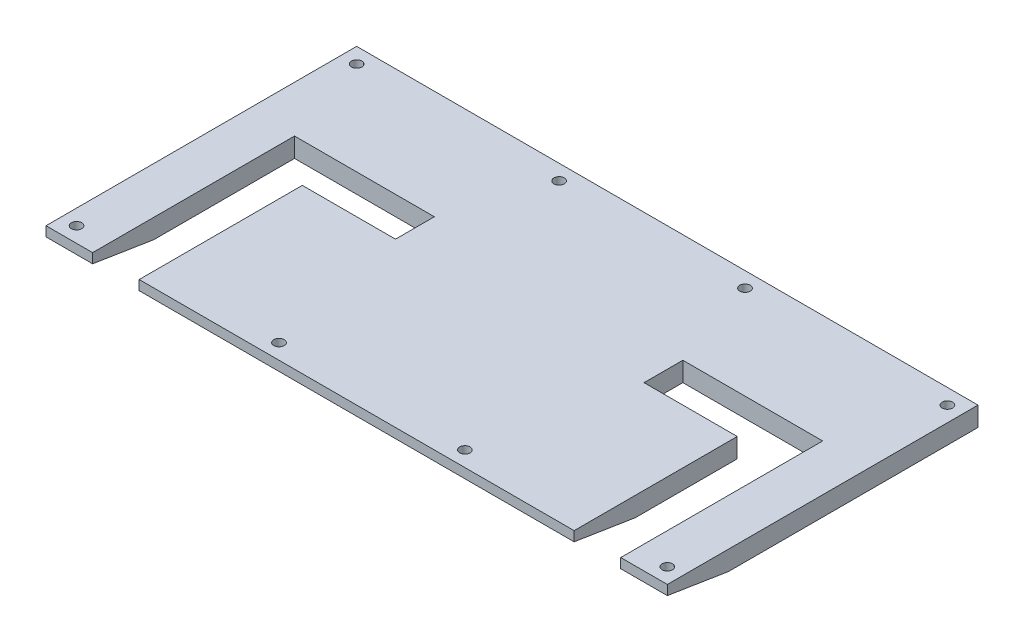
ISO-10303-21;
HEADER;
FILE_DESCRIPTION(('STEP AP214'),'2;1');
FILE_NAME('part.step','',(''),(''),'','','');
FILE_SCHEMA(('AUTOMOTIVE_DESIGN { 1 0 10303 214 1 1 1 1 }'));
ENDSEC;
DATA;
#1=APPLICATION_CONTEXT('core data for automotive mechanical design processes');
#2=APPLICATION_PROTOCOL_DEFINITION('international standard','automotive_design',2000,#1);
#3=PRODUCT_CONTEXT('',#1,'mechanical');
#4=PRODUCT('Part','Part','',(#3));
#5=PRODUCT_RELATED_PRODUCT_CATEGORY('part','',(#4));
#6=PRODUCT_DEFINITION_FORMATION('','',#4);
#7=PRODUCT_DEFINITION_CONTEXT('part definition',#1,'design');
#8=PRODUCT_DEFINITION('design','',#6,#7);
#9=PRODUCT_DEFINITION_SHAPE('','',#8);
#10=(LENGTH_UNIT() NAMED_UNIT(*) SI_UNIT(.MILLI.,.METRE.));
#11=(NAMED_UNIT(*) PLANE_ANGLE_UNIT() SI_UNIT($,.RADIAN.));
#12=(NAMED_UNIT(*) SI_UNIT($,.STERADIAN.) SOLID_ANGLE_UNIT());
#13=UNCERTAINTY_MEASURE_WITH_UNIT(LENGTH_MEASURE(1.E-05),#10,'distance_accuracy_value','');
#14=(GEOMETRIC_REPRESENTATION_CONTEXT(3) GLOBAL_UNCERTAINTY_ASSIGNED_CONTEXT((#13)) GLOBAL_UNIT_ASSIGNED_CONTEXT((#10,
#11,#12)) REPRESENTATION_CONTEXT('',''));
#15=CARTESIAN_POINT('',(0.,0.,0.));
#16=DIRECTION('',(0.,0.,1.));
#17=DIRECTION('',(1.,0.,0.));
#18=AXIS2_PLACEMENT_3D('',#15,#16,#17);
#19=CARTESIAN_POINT('',(10.,6.35,0.));
#20=DIRECTION('',(0.,0.,-1.));
#21=DIRECTION('',(-1.,0.,0.));
#22=AXIS2_PLACEMENT_3D('',#19,#20,#21);
#23=PLANE('',#22);
#24=DIRECTION('',(-1.,0.,0.));
#25=VECTOR('',#24,1.);
#26=CARTESIAN_POINT('',(76.2,3.175,0.));
#27=LINE('',#26,#25);
#28=CARTESIAN_POINT('',(45.72,3.175,0.));
#29=VERTEX_POINT('',#28);
#30=CARTESIAN_POINT('',(-96.52,3.175,0.));
#31=VERTEX_POINT('',#30);
#32=EDGE_CURVE('E227',#29,#31,#27,.T.);
#33=ORIENTED_EDGE('',*,*,#32,.F.);
#34=DIRECTION('',(0.,-1.,0.));
#35=VECTOR('',#34,1.);
#36=CARTESIAN_POINT('',(45.72,6.35,0.));
#37=LINE('',#36,#35);
#38=CARTESIAN_POINT('',(45.72,6.35,0.));
#39=VERTEX_POINT('',#38);
#40=EDGE_CURVE('E11',#39,#29,#37,.T.);
#41=ORIENTED_EDGE('',*,*,#40,.F.);
#42=DIRECTION('',(1.,0.,0.));
#43=VECTOR('',#42,1.);
#44=CARTESIAN_POINT('',(0.,6.35,0.));
#45=LINE('',#44,#43);
#46=CARTESIAN_POINT('',(-96.52,6.35,0.));
#47=VERTEX_POINT('',#46);
#48=EDGE_CURVE('E97',#47,#39,#45,.T.);
#49=ORIENTED_EDGE('',*,*,#48,.F.);
#50=DIRECTION('',(0.,-1.,0.));
#51=VECTOR('',#50,1.);
#52=CARTESIAN_POINT('',(-96.52,6.35,0.));
#53=LINE('',#52,#51);
#54=EDGE_CURVE('E234',#47,#31,#53,.T.);
#55=ORIENTED_EDGE('',*,*,#54,.T.);
#56=EDGE_LOOP('',(#33,#41,#49,#55));
#57=FACE_BOUND('',#56,.T.);
#58=ADVANCED_FACE('F41',(#57),#23,.F.);
#59=CARTESIAN_POINT('',(45.72,6.35,0.));
#60=DIRECTION('',(-1.,0.,0.));
#61=DIRECTION('',(0.,0.,1.));
#62=AXIS2_PLACEMENT_3D('',#59,#60,#61);
#63=PLANE('',#62);
#64=DIRECTION('',(0.,0.156786658464522,0.987632494264709));
#65=VECTOR('',#64,1.);
#66=CARTESIAN_POINT('',(45.72,3.25304802866509,0.491641125449416));
#67=LINE('',#66,#65);
#68=CARTESIAN_POINT('',(45.72,0.,-20.));
#69=VERTEX_POINT('',#68);
#70=EDGE_CURVE('E211',#69,#29,#67,.T.);
#71=ORIENTED_EDGE('',*,*,#70,.F.);
#72=DIRECTION('',(0.,0.,-1.));
#73=VECTOR('',#72,1.);
#74=CARTESIAN_POINT('',(45.72,0.,0.));
#75=LINE('',#74,#73);
#76=CARTESIAN_POINT('',(45.72,0.,-53.34));
#77=VERTEX_POINT('',#76);
#78=EDGE_CURVE('E145',#69,#77,#75,.T.);
#79=ORIENTED_EDGE('',*,*,#78,.T.);
#80=DIRECTION('',(0.,-1.,0.));
#81=VECTOR('',#80,1.);
#82=CARTESIAN_POINT('',(45.72,6.35,-53.34));
#83=LINE('',#82,#81);
#84=CARTESIAN_POINT('',(45.72,6.35,-53.34));
#85=VERTEX_POINT('',#84);
#86=EDGE_CURVE('E49',#85,#77,#83,.T.);
#87=ORIENTED_EDGE('',*,*,#86,.F.);
#88=DIRECTION('',(0.,0.,-1.));
#89=VECTOR('',#88,1.);
#90=CARTESIAN_POINT('',(45.72,6.35,0.));
#91=LINE('',#90,#89);
#92=EDGE_CURVE('E198',#39,#85,#91,.T.);
#93=ORIENTED_EDGE('',*,*,#92,.F.);
#94=ORIENTED_EDGE('',*,*,#40,.T.);
#95=EDGE_LOOP('',(#71,#79,#87,#93,#94));
#96=FACE_BOUND('',#95,.T.);
#97=ADVANCED_FACE('F384',(#96),#63,.F.);
#98=CARTESIAN_POINT('',(60.96,6.35,-66.04));
#99=DIRECTION('',(1.,0.,0.));
#100=DIRECTION('',(0.,0.,-1.));
#101=AXIS2_PLACEMENT_3D('',#98,#99,#100);
#102=PLANE('',#101);
#103=DIRECTION('',(0.,-0.156786658464522,-0.987632494264709));
#104=VECTOR('',#103,1.);
#105=CARTESIAN_POINT('',(60.96,-6.97308738068276,-63.9249598783166));
#106=LINE('',#105,#104);
#107=CARTESIAN_POINT('',(60.96,3.175,0.));
#108=VERTEX_POINT('',#107);
#109=CARTESIAN_POINT('',(60.96,0.,-20.));
#110=VERTEX_POINT('',#109);
#111=EDGE_CURVE('E56',#108,#110,#106,.T.);
#112=ORIENTED_EDGE('',*,*,#111,.F.);
#113=DIRECTION('',(0.,-1.,0.));
#114=VECTOR('',#113,1.);
#115=CARTESIAN_POINT('',(60.96,6.35,0.));
#116=LINE('',#115,#114);
#117=CARTESIAN_POINT('',(60.96,6.35,0.));
#118=VERTEX_POINT('',#117);
#119=EDGE_CURVE('E127',#118,#108,#116,.T.);
#120=ORIENTED_EDGE('',*,*,#119,.F.);
#121=DIRECTION('',(0.,0.,1.));
#122=VECTOR('',#121,1.);
#123=CARTESIAN_POINT('',(60.96,6.35,-66.04));
#124=LINE('',#123,#122);
#125=CARTESIAN_POINT('',(60.96,6.35,-66.04));
#126=VERTEX_POINT('',#125);
#127=EDGE_CURVE('E113',#126,#118,#124,.T.);
#128=ORIENTED_EDGE('',*,*,#127,.F.);
#129=DIRECTION('',(0.,-1.,0.));
#130=VECTOR('',#129,1.);
#131=CARTESIAN_POINT('',(60.96,6.35,-66.04));
#132=LINE('',#131,#130);
#133=CARTESIAN_POINT('',(60.96,0.,-66.04));
#134=VERTEX_POINT('',#133);
#135=EDGE_CURVE('E133',#126,#134,#132,.T.);
#136=ORIENTED_EDGE('',*,*,#135,.T.);
#137=DIRECTION('',(0.,0.,1.));
#138=VECTOR('',#137,1.);
#139=CARTESIAN_POINT('',(60.96,0.,-66.04));
#140=LINE('',#139,#138);
#141=EDGE_CURVE('E154',#134,#110,#140,.T.);
#142=ORIENTED_EDGE('',*,*,#141,.T.);
#143=EDGE_LOOP('',(#112,#120,#128,#136,#142));
#144=FACE_BOUND('',#143,.T.);
#145=ADVANCED_FACE('F128',(#144),#102,.F.);
#146=CARTESIAN_POINT('',(60.96,6.35,0.));
#147=DIRECTION('',(0.,0.,-1.));
#148=DIRECTION('',(-1.,0.,0.));
#149=AXIS2_PLACEMENT_3D('',#146,#147,#148);
#150=PLANE('',#149);
#151=CARTESIAN_POINT('',(76.2,3.175,0.));
#152=VERTEX_POINT('',#151);
#153=EDGE_CURVE('E229',#152,#108,#27,.T.);
#154=ORIENTED_EDGE('',*,*,#153,.F.);
#155=DIRECTION('',(0.,-1.,0.));
#156=VECTOR('',#155,1.);
#157=CARTESIAN_POINT('',(76.2,6.35,0.));
#158=LINE('',#157,#156);
#159=CARTESIAN_POINT('',(76.2,6.35,0.));
#160=VERTEX_POINT('',#159);
#161=EDGE_CURVE('E134',#160,#152,#158,.T.);
#162=ORIENTED_EDGE('',*,*,#161,.F.);
#163=DIRECTION('',(1.,0.,0.));
#164=VECTOR('',#163,1.);
#165=CARTESIAN_POINT('',(60.96,6.35,0.));
#166=LINE('',#165,#164);
#167=EDGE_CURVE('E118',#118,#160,#166,.T.);
#168=ORIENTED_EDGE('',*,*,#167,.F.);
#169=ORIENTED_EDGE('',*,*,#119,.T.);
#170=EDGE_LOOP('',(#154,#162,#168,#169));
#171=FACE_BOUND('',#170,.T.);
#172=ADVANCED_FACE('F136',(#171),#150,.F.);
#173=CARTESIAN_POINT('',(76.2,6.35,0.));
#174=DIRECTION('',(-1.,0.,0.));
#175=DIRECTION('',(0.,0.,1.));
#176=AXIS2_PLACEMENT_3D('',#173,#174,#175);
#177=PLANE('',#176);
#178=DIRECTION('',(0.,0.156786658464522,0.987632494264709));
#179=VECTOR('',#178,1.);
#180=CARTESIAN_POINT('',(76.2,3.0969519713349,-0.491641125449416));
#181=LINE('',#180,#179);
#182=CARTESIAN_POINT('',(76.2,0.,-20.));
#183=VERTEX_POINT('',#182);
#184=EDGE_CURVE('E231',#183,#152,#181,.T.);
#185=ORIENTED_EDGE('',*,*,#184,.F.);
#186=DIRECTION('',(0.,0.,-1.));
#187=VECTOR('',#186,1.);
#188=CARTESIAN_POINT('',(76.2,0.,0.));
#189=LINE('',#188,#187);
#190=CARTESIAN_POINT('',(76.2,0.,-101.6));
#191=VERTEX_POINT('',#190);
#192=EDGE_CURVE('E89',#183,#191,#189,.T.);
#193=ORIENTED_EDGE('',*,*,#192,.T.);
#194=DIRECTION('',(0.,-1.,0.));
#195=VECTOR('',#194,1.);
#196=CARTESIAN_POINT('',(76.2,6.35,-101.6));
#197=LINE('',#196,#195);
#198=CARTESIAN_POINT('',(76.2,6.35,-101.6));
#199=VERTEX_POINT('',#198);
#200=EDGE_CURVE('E144',#199,#191,#197,.T.);
#201=ORIENTED_EDGE('',*,*,#200,.F.);
#202=DIRECTION('',(0.,0.,-1.));
#203=VECTOR('',#202,1.);
#204=CARTESIAN_POINT('',(76.2,6.35,0.));
#205=LINE('',#204,#203);
#206=EDGE_CURVE('E65',#160,#199,#205,.T.);
#207=ORIENTED_EDGE('',*,*,#206,.F.);
#208=ORIENTED_EDGE('',*,*,#161,.T.);
#209=EDGE_LOOP('',(#185,#193,#201,#207,#208));
#210=FACE_BOUND('',#209,.T.);
#211=ADVANCED_FACE('F403',(#210),#177,.F.);
#212=CARTESIAN_POINT('',(0.,0.,0.));
#213=DIRECTION('',(0.,-1.,0.));
#214=DIRECTION('',(0.,0.,-1.));
#215=AXIS2_PLACEMENT_3D('',#212,#213,#214);
#216=PLANE('',#215);
#217=CARTESIAN_POINT('',(71.2,0.,-96.6));
#218=DIRECTION('',(0.,1.,0.));
#219=DIRECTION('',(0.,0.,-1.));
#220=AXIS2_PLACEMENT_3D('',#217,#218,#219);
#221=CIRCLE('',#220,1.7);
#222=CARTESIAN_POINT('',(71.2,0.,-98.3));
#223=VERTEX_POINT('',#222);
#224=EDGE_CURVE('E214',#223,#223,#221,.T.);
#225=ORIENTED_EDGE('',*,*,#224,.T.);
#226=EDGE_LOOP('',(#225));
#227=FACE_BOUND('',#226,.T.);
#228=CARTESIAN_POINT('',(5.,0.,-96.6));
#229=DIRECTION('',(0.,1.,0.));
#230=DIRECTION('',(0.,0.,1.));
#231=AXIS2_PLACEMENT_3D('',#228,#229,#230);
#232=CIRCLE('',#231,1.7);
#233=CARTESIAN_POINT('',(5.,0.,-94.9));
#234=VERTEX_POINT('',#233);
#235=EDGE_CURVE('E148',#234,#234,#232,.T.);
#236=ORIENTED_EDGE('',*,*,#235,.T.);
#237=EDGE_LOOP('',(#236));
#238=FACE_BOUND('',#237,.T.);
#239=ORIENTED_EDGE('',*,*,#192,.F.);
#240=DIRECTION('',(-1.,0.,0.));
#241=VECTOR('',#240,1.);
#242=CARTESIAN_POINT('',(76.2,0.,-20.));
#243=LINE('',#242,#241);
#244=EDGE_CURVE('E225',#183,#110,#243,.T.);
#245=ORIENTED_EDGE('',*,*,#244,.T.);
#246=ORIENTED_EDGE('',*,*,#141,.F.);
#247=DIRECTION('',(1.,0.,0.));
#248=VECTOR('',#247,1.);
#249=CARTESIAN_POINT('',(15.24,0.,-66.04));
#250=LINE('',#249,#248);
#251=CARTESIAN_POINT('',(15.24,0.,-66.04));
#252=VERTEX_POINT('',#251);
#253=EDGE_CURVE('E152',#252,#134,#250,.T.);
#254=ORIENTED_EDGE('',*,*,#253,.F.);
#255=DIRECTION('',(0.,0.,-1.));
#256=VECTOR('',#255,1.);
#257=CARTESIAN_POINT('',(15.24,0.,-53.34));
#258=LINE('',#257,#256);
#259=CARTESIAN_POINT('',(15.24,0.,-53.34));
#260=VERTEX_POINT('',#259);
#261=EDGE_CURVE('E150',#260,#252,#258,.T.);
#262=ORIENTED_EDGE('',*,*,#261,.F.);
#263=DIRECTION('',(-1.,0.,0.));
#264=VECTOR('',#263,1.);
#265=CARTESIAN_POINT('',(15.24,0.,-53.34));
#266=LINE('',#265,#264);
#267=EDGE_CURVE('E147',#77,#260,#266,.T.);
#268=ORIENTED_EDGE('',*,*,#267,.F.);
#269=ORIENTED_EDGE('',*,*,#78,.F.);
#270=CARTESIAN_POINT('',(-96.52,0.,-20.));
#271=VERTEX_POINT('',#270);
#272=EDGE_CURVE('E228',#69,#271,#243,.T.);
#273=ORIENTED_EDGE('',*,*,#272,.T.);
#274=DIRECTION('',(0.,0.,-1.));
#275=VECTOR('',#274,1.);
#276=CARTESIAN_POINT('',(-96.52,0.,0.));
#277=LINE('',#276,#275);
#278=CARTESIAN_POINT('',(-96.52,0.,-53.34));
#279=VERTEX_POINT('',#278);
#280=EDGE_CURVE('E280',#271,#279,#277,.T.);
#281=ORIENTED_EDGE('',*,*,#280,.T.);
#282=DIRECTION('',(1.,0.,0.));
#283=VECTOR('',#282,1.);
#284=CARTESIAN_POINT('',(-66.04,0.,-53.34));
#285=LINE('',#284,#283);
#286=CARTESIAN_POINT('',(-66.04,0.,-53.34));
#287=VERTEX_POINT('',#286);
#288=EDGE_CURVE('E277',#279,#287,#285,.T.);
#289=ORIENTED_EDGE('',*,*,#288,.T.);
#290=DIRECTION('',(0.,0.,-1.));
#291=VECTOR('',#290,1.);
#292=CARTESIAN_POINT('',(-66.04,0.,-53.34));
#293=LINE('',#292,#291);
#294=CARTESIAN_POINT('',(-66.04,0.,-66.04));
#295=VERTEX_POINT('',#294);
#296=EDGE_CURVE('E274',#287,#295,#293,.T.);
#297=ORIENTED_EDGE('',*,*,#296,.T.);
#298=DIRECTION('',(-1.,0.,0.));
#299=VECTOR('',#298,1.);
#300=CARTESIAN_POINT('',(-66.04,0.,-66.04));
#301=LINE('',#300,#299);
#302=CARTESIAN_POINT('',(-111.76,0.,-66.04));
#303=VERTEX_POINT('',#302);
#304=EDGE_CURVE('E271',#295,#303,#301,.T.);
#305=ORIENTED_EDGE('',*,*,#304,.T.);
#306=DIRECTION('',(0.,0.,1.));
#307=VECTOR('',#306,1.);
#308=CARTESIAN_POINT('',(-111.76,0.,-66.04));
#309=LINE('',#308,#307);
#310=CARTESIAN_POINT('',(-111.76,0.,-20.));
#311=VERTEX_POINT('',#310);
#312=EDGE_CURVE('E268',#303,#311,#309,.T.);
#313=ORIENTED_EDGE('',*,*,#312,.T.);
#314=DIRECTION('',(1.,0.,0.));
#315=VECTOR('',#314,1.);
#316=CARTESIAN_POINT('',(-127.,0.,-20.));
#317=LINE('',#316,#315);
#318=CARTESIAN_POINT('',(-127.,0.,-20.));
#319=VERTEX_POINT('',#318);
#320=EDGE_CURVE('E328',#319,#311,#317,.T.);
#321=ORIENTED_EDGE('',*,*,#320,.F.);
#322=DIRECTION('',(0.,0.,-1.));
#323=VECTOR('',#322,1.);
#324=CARTESIAN_POINT('',(-127.,0.,0.));
#325=LINE('',#324,#323);
#326=CARTESIAN_POINT('',(-127.,0.,-101.6));
#327=VERTEX_POINT('',#326);
#328=EDGE_CURVE('E264',#319,#327,#325,.T.);
#329=ORIENTED_EDGE('',*,*,#328,.T.);
#330=DIRECTION('',(-1.,0.,0.));
#331=VECTOR('',#330,1.);
#332=CARTESIAN_POINT('',(0.,0.,-101.6));
#333=LINE('',#332,#331);
#334=EDGE_CURVE('E157',#191,#327,#333,.T.);
#335=ORIENTED_EDGE('',*,*,#334,.F.);
#336=EDGE_LOOP('',(#239,#245,#246,#254,#262,#268,#269,#273,#281,#289,#297,#305,#313,#321,#329,#335));
#337=FACE_BOUND('',#336,.T.);
#338=CARTESIAN_POINT('',(-122.,0.,-96.6));
#339=DIRECTION('',(0.,-1.,0.));
#340=DIRECTION('',(0.,0.,-1.));
#341=AXIS2_PLACEMENT_3D('',#338,#339,#340);
#342=CIRCLE('',#341,1.7);
#343=CARTESIAN_POINT('',(-122.,0.,-98.3));
#344=VERTEX_POINT('',#343);
#345=EDGE_CURVE('E316',#344,#344,#342,.T.);
#346=ORIENTED_EDGE('',*,*,#345,.F.);
#347=EDGE_LOOP('',(#346));
#348=FACE_BOUND('',#347,.T.);
#349=CARTESIAN_POINT('',(-55.8,0.,-96.6));
#350=DIRECTION('',(0.,-1.,0.));
#351=DIRECTION('',(0.,0.,1.));
#352=AXIS2_PLACEMENT_3D('',#349,#350,#351);
#353=CIRCLE('',#352,1.7);
#354=CARTESIAN_POINT('',(-55.8,0.,-94.9));
#355=VERTEX_POINT('',#354);
#356=EDGE_CURVE('E283',#355,#355,#353,.T.);
#357=ORIENTED_EDGE('',*,*,#356,.F.);
#358=EDGE_LOOP('',(#357));
#359=FACE_BOUND('',#358,.T.);
#360=ADVANCED_FACE('F182',(#227,#238,#337,#348,#359),#216,.T.);
#361=CARTESIAN_POINT('',(71.2,0.,-5.00000000000002));
#362=DIRECTION('',(0.,1.,0.));
#363=DIRECTION('',(0.,0.,1.));
#364=AXIS2_PLACEMENT_3D('',#361,#362,#363);
#365=CYLINDRICAL_SURFACE('',#364,1.7);
#366=CARTESIAN_POINT('',(71.2,6.35,-5.00000000000002));
#367=DIRECTION('',(0.,1.,0.));
#368=DIRECTION('',(0.,0.,1.));
#369=AXIS2_PLACEMENT_3D('',#366,#367,#368);
#370=CIRCLE('',#369,1.7);
#371=CARTESIAN_POINT('',(71.2,6.35,-3.30000000000002));
#372=VERTEX_POINT('',#371);
#373=EDGE_CURVE('E210',#372,#372,#370,.T.);
#374=ORIENTED_EDGE('',*,*,#373,.T.);
#375=EDGE_LOOP('',(#374));
#376=FACE_BOUND('',#375,.T.);
#377=CARTESIAN_POINT('',(71.2,2.38125,-5.00000000000002));
#378=DIRECTION('',(0.,-0.987632494264708,0.156786658464522));
#379=DIRECTION('',(0.,0.156786658464522,0.987632494264709));
#380=AXIS2_PLACEMENT_3D('',#377,#378,#379);
#381=ELLIPSE('',#380,1.72128803970312,1.7);
#382=CARTESIAN_POINT('',(71.2,2.651125,-3.30000000000002));
#383=VERTEX_POINT('',#382);
#384=EDGE_CURVE('E222',#383,#383,#381,.F.);
#385=ORIENTED_EDGE('',*,*,#384,.F.);
#386=EDGE_LOOP('',(#385));
#387=FACE_BOUND('',#386,.T.);
#388=ADVANCED_FACE('F411',(#376,#387),#365,.F.);
#389=CARTESIAN_POINT('',(5.,0.,-5.));
#390=DIRECTION('',(0.,1.,0.));
#391=DIRECTION('',(0.,0.,1.));
#392=AXIS2_PLACEMENT_3D('',#389,#390,#391);
#393=CYLINDRICAL_SURFACE('',#392,1.7);
#394=CARTESIAN_POINT('',(5.,6.35,-5.));
#395=DIRECTION('',(0.,1.,0.));
#396=DIRECTION('',(0.,0.,-1.));
#397=AXIS2_PLACEMENT_3D('',#394,#395,#396);
#398=CIRCLE('',#397,1.7);
#399=CARTESIAN_POINT('',(5.,6.35,-6.7));
#400=VERTEX_POINT('',#399);
#401=EDGE_CURVE('E207',#400,#400,#398,.T.);
#402=ORIENTED_EDGE('',*,*,#401,.T.);
#403=EDGE_LOOP('',(#402));
#404=FACE_BOUND('',#403,.T.);
#405=CARTESIAN_POINT('',(5.,2.38125,-5.));
#406=DIRECTION('',(0.,-0.987632494264708,0.156786658464522));
#407=DIRECTION('',(0.,0.156786658464522,0.987632494264709));
#408=AXIS2_PLACEMENT_3D('',#405,#406,#407);
#409=ELLIPSE('',#408,1.72128803970312,1.7);
#410=CARTESIAN_POINT('',(5.,2.651125,-3.3));
#411=VERTEX_POINT('',#410);
#412=EDGE_CURVE('E44',#411,#411,#409,.F.);
#413=ORIENTED_EDGE('',*,*,#412,.F.);
#414=EDGE_LOOP('',(#413));
#415=FACE_BOUND('',#414,.T.);
#416=ADVANCED_FACE('F395',(#404,#415),#393,.F.);
#417=CARTESIAN_POINT('',(15.24,6.35,-53.34));
#418=DIRECTION('',(0.,0.,1.));
#419=DIRECTION('',(1.,0.,0.));
#420=AXIS2_PLACEMENT_3D('',#417,#418,#419);
#421=PLANE('',#420);
#422=ORIENTED_EDGE('',*,*,#267,.T.);
#423=DIRECTION('',(0.,-1.,0.));
#424=VECTOR('',#423,1.);
#425=CARTESIAN_POINT('',(15.24,6.35,-53.34));
#426=LINE('',#425,#424);
#427=CARTESIAN_POINT('',(15.24,6.35,-53.34));
#428=VERTEX_POINT('',#427);
#429=EDGE_CURVE('E166',#428,#260,#426,.T.);
#430=ORIENTED_EDGE('',*,*,#429,.F.);
#431=DIRECTION('',(-1.,0.,0.));
#432=VECTOR('',#431,1.);
#433=CARTESIAN_POINT('',(15.24,6.35,-53.34));
#434=LINE('',#433,#432);
#435=EDGE_CURVE('E176',#85,#428,#434,.T.);
#436=ORIENTED_EDGE('',*,*,#435,.F.);
#437=ORIENTED_EDGE('',*,*,#86,.T.);
#438=EDGE_LOOP('',(#422,#430,#436,#437));
#439=FACE_BOUND('',#438,.T.);
#440=ADVANCED_FACE('F174',(#439),#421,.F.);
#441=CARTESIAN_POINT('',(15.24,6.35,-53.34));
#442=DIRECTION('',(-1.,0.,0.));
#443=DIRECTION('',(0.,0.,1.));
#444=AXIS2_PLACEMENT_3D('',#441,#442,#443);
#445=PLANE('',#444);
#446=ORIENTED_EDGE('',*,*,#261,.T.);
#447=DIRECTION('',(0.,-1.,0.));
#448=VECTOR('',#447,1.);
#449=CARTESIAN_POINT('',(15.24,6.35,-66.04));
#450=LINE('',#449,#448);
#451=CARTESIAN_POINT('',(15.24,6.35,-66.04));
#452=VERTEX_POINT('',#451);
#453=EDGE_CURVE('E163',#452,#252,#450,.T.);
#454=ORIENTED_EDGE('',*,*,#453,.F.);
#455=DIRECTION('',(0.,0.,-1.));
#456=VECTOR('',#455,1.);
#457=CARTESIAN_POINT('',(15.24,6.35,-53.34));
#458=LINE('',#457,#456);
#459=EDGE_CURVE('E194',#428,#452,#458,.T.);
#460=ORIENTED_EDGE('',*,*,#459,.F.);
#461=ORIENTED_EDGE('',*,*,#429,.T.);
#462=EDGE_LOOP('',(#446,#454,#460,#461));
#463=FACE_BOUND('',#462,.T.);
#464=ADVANCED_FACE('F190',(#463),#445,.F.);
#465=CARTESIAN_POINT('',(15.24,6.35,-66.04));
#466=DIRECTION('',(0.,0.,-1.));
#467=DIRECTION('',(-1.,0.,0.));
#468=AXIS2_PLACEMENT_3D('',#465,#466,#467);
#469=PLANE('',#468);
#470=ORIENTED_EDGE('',*,*,#253,.T.);
#471=ORIENTED_EDGE('',*,*,#135,.F.);
#472=DIRECTION('',(1.,0.,0.));
#473=VECTOR('',#472,1.);
#474=CARTESIAN_POINT('',(15.24,6.35,-66.04));
#475=LINE('',#474,#473);
#476=EDGE_CURVE('E121',#452,#126,#475,.T.);
#477=ORIENTED_EDGE('',*,*,#476,.F.);
#478=ORIENTED_EDGE('',*,*,#453,.T.);
#479=EDGE_LOOP('',(#470,#471,#477,#478));
#480=FACE_BOUND('',#479,.T.);
#481=ADVANCED_FACE('F193',(#480),#469,.F.);
#482=CARTESIAN_POINT('',(0.,6.35,-101.6));
#483=DIRECTION('',(0.,0.,1.));
#484=DIRECTION('',(1.,0.,0.));
#485=AXIS2_PLACEMENT_3D('',#482,#483,#484);
#486=PLANE('',#485);
#487=ORIENTED_EDGE('',*,*,#334,.T.);
#488=DIRECTION('',(0.,-1.,0.));
#489=VECTOR('',#488,1.);
#490=CARTESIAN_POINT('',(-127.,6.35,-101.6));
#491=LINE('',#490,#489);
#492=CARTESIAN_POINT('',(-127.,6.35,-101.6));
#493=VERTEX_POINT('',#492);
#494=EDGE_CURVE('E260',#493,#327,#491,.T.);
#495=ORIENTED_EDGE('',*,*,#494,.F.);
#496=DIRECTION('',(-1.,0.,0.));
#497=VECTOR('',#496,1.);
#498=CARTESIAN_POINT('',(0.,6.35,-101.6));
#499=LINE('',#498,#497);
#500=EDGE_CURVE('E139',#199,#493,#499,.T.);
#501=ORIENTED_EDGE('',*,*,#500,.F.);
#502=ORIENTED_EDGE('',*,*,#200,.T.);
#503=EDGE_LOOP('',(#487,#495,#501,#502));
#504=FACE_BOUND('',#503,.T.);
#505=ADVANCED_FACE('F399',(#504),#486,.F.);
#506=CARTESIAN_POINT('',(0.,6.35,0.));
#507=DIRECTION('',(0.,-1.,0.));
#508=DIRECTION('',(0.,0.,-1.));
#509=AXIS2_PLACEMENT_3D('',#506,#507,#508);
#510=PLANE('',#509);
#511=ORIENTED_EDGE('',*,*,#401,.F.);
#512=EDGE_LOOP('',(#511));
#513=FACE_BOUND('',#512,.T.);
#514=ORIENTED_EDGE('',*,*,#373,.F.);
#515=EDGE_LOOP('',(#514));
#516=FACE_BOUND('',#515,.T.);
#517=CARTESIAN_POINT('',(71.2,6.35,-96.6));
#518=DIRECTION('',(0.,1.,0.));
#519=DIRECTION('',(0.,0.,-1.));
#520=AXIS2_PLACEMENT_3D('',#517,#518,#519);
#521=CIRCLE('',#520,1.7);
#522=CARTESIAN_POINT('',(71.2,6.35,-98.3));
#523=VERTEX_POINT('',#522);
#524=EDGE_CURVE('E204',#523,#523,#521,.T.);
#525=ORIENTED_EDGE('',*,*,#524,.F.);
#526=EDGE_LOOP('',(#525));
#527=FACE_BOUND('',#526,.T.);
#528=CARTESIAN_POINT('',(5.,6.35,-96.6));
#529=DIRECTION('',(0.,1.,0.));
#530=DIRECTION('',(0.,0.,1.));
#531=AXIS2_PLACEMENT_3D('',#528,#529,#530);
#532=CIRCLE('',#531,1.7);
#533=CARTESIAN_POINT('',(5.,6.35,-94.9));
#534=VERTEX_POINT('',#533);
#535=EDGE_CURVE('E201',#534,#534,#532,.T.);
#536=ORIENTED_EDGE('',*,*,#535,.F.);
#537=EDGE_LOOP('',(#536));
#538=FACE_BOUND('',#537,.T.);
#539=ORIENTED_EDGE('',*,*,#500,.T.);
#540=DIRECTION('',(0.,0.,-1.));
#541=VECTOR('',#540,1.);
#542=CARTESIAN_POINT('',(-127.,6.35,0.));
#543=LINE('',#542,#541);
#544=CARTESIAN_POINT('',(-127.,6.35,0.));
#545=VERTEX_POINT('',#544);
#546=EDGE_CURVE('E263',#545,#493,#543,.T.);
#547=ORIENTED_EDGE('',*,*,#546,.F.);
#548=DIRECTION('',(-1.,0.,0.));
#549=VECTOR('',#548,1.);
#550=CARTESIAN_POINT('',(-111.76,6.35,0.));
#551=LINE('',#550,#549);
#552=CARTESIAN_POINT('',(-111.76,6.35,0.));
#553=VERTEX_POINT('',#552);
#554=EDGE_CURVE('E286',#553,#545,#551,.T.);
#555=ORIENTED_EDGE('',*,*,#554,.F.);
#556=DIRECTION('',(0.,0.,1.));
#557=VECTOR('',#556,1.);
#558=CARTESIAN_POINT('',(-111.76,6.35,-66.04));
#559=LINE('',#558,#557);
#560=CARTESIAN_POINT('',(-111.76,6.35,-66.04));
#561=VERTEX_POINT('',#560);
#562=EDGE_CURVE('E289',#561,#553,#559,.T.);
#563=ORIENTED_EDGE('',*,*,#562,.F.);
#564=DIRECTION('',(-1.,0.,0.));
#565=VECTOR('',#564,1.);
#566=CARTESIAN_POINT('',(-66.04,6.35,-66.04));
#567=LINE('',#566,#565);
#568=CARTESIAN_POINT('',(-66.04,6.35,-66.04));
#569=VERTEX_POINT('',#568);
#570=EDGE_CURVE('E292',#569,#561,#567,.T.);
#571=ORIENTED_EDGE('',*,*,#570,.F.);
#572=DIRECTION('',(0.,0.,-1.));
#573=VECTOR('',#572,1.);
#574=CARTESIAN_POINT('',(-66.04,6.35,-53.34));
#575=LINE('',#574,#573);
#576=CARTESIAN_POINT('',(-66.04,6.35,-53.34));
#577=VERTEX_POINT('',#576);
#578=EDGE_CURVE('E295',#577,#569,#575,.T.);
#579=ORIENTED_EDGE('',*,*,#578,.F.);
#580=DIRECTION('',(1.,0.,0.));
#581=VECTOR('',#580,1.);
#582=CARTESIAN_POINT('',(-66.04,6.35,-53.34));
#583=LINE('',#582,#581);
#584=CARTESIAN_POINT('',(-96.52,6.35,-53.34));
#585=VERTEX_POINT('',#584);
#586=EDGE_CURVE('E298',#585,#577,#583,.T.);
#587=ORIENTED_EDGE('',*,*,#586,.F.);
#588=DIRECTION('',(0.,0.,-1.));
#589=VECTOR('',#588,1.);
#590=CARTESIAN_POINT('',(-96.52,6.35,0.));
#591=LINE('',#590,#589);
#592=EDGE_CURVE('E267',#47,#585,#591,.T.);
#593=ORIENTED_EDGE('',*,*,#592,.F.);
#594=ORIENTED_EDGE('',*,*,#48,.T.);
#595=ORIENTED_EDGE('',*,*,#92,.T.);
#596=ORIENTED_EDGE('',*,*,#435,.T.);
#597=ORIENTED_EDGE('',*,*,#459,.T.);
#598=ORIENTED_EDGE('',*,*,#476,.T.);
#599=ORIENTED_EDGE('',*,*,#127,.T.);
#600=ORIENTED_EDGE('',*,*,#167,.T.);
#601=ORIENTED_EDGE('',*,*,#206,.T.);
#602=EDGE_LOOP('',(#539,#547,#555,#563,#571,#579,#587,#593,#594,#595,#596,#597,#598,#599,#600,#601));
#603=FACE_BOUND('',#602,.T.);
#604=CARTESIAN_POINT('',(-55.8,6.35,-5.));
#605=DIRECTION('',(0.,-1.,0.));
#606=DIRECTION('',(0.,0.,-1.));
#607=AXIS2_PLACEMENT_3D('',#604,#605,#606);
#608=CIRCLE('',#607,1.7);
#609=CARTESIAN_POINT('',(-55.8,6.35,-6.7));
#610=VERTEX_POINT('',#609);
#611=EDGE_CURVE('E309',#610,#610,#608,.T.);
#612=ORIENTED_EDGE('',*,*,#611,.T.);
#613=EDGE_LOOP('',(#612));
#614=FACE_BOUND('',#613,.T.);
#615=CARTESIAN_POINT('',(-122.,6.35,-5.00000000000002));
#616=DIRECTION('',(0.,-1.,0.));
#617=DIRECTION('',(0.,0.,1.));
#618=AXIS2_PLACEMENT_3D('',#615,#616,#617);
#619=CIRCLE('',#618,1.7);
#620=CARTESIAN_POINT('',(-122.,6.35,-3.30000000000002));
#621=VERTEX_POINT('',#620);
#622=EDGE_CURVE('E312',#621,#621,#619,.T.);
#623=ORIENTED_EDGE('',*,*,#622,.T.);
#624=EDGE_LOOP('',(#623));
#625=FACE_BOUND('',#624,.T.);
#626=CARTESIAN_POINT('',(-122.,6.35,-96.6));
#627=DIRECTION('',(0.,-1.,0.));
#628=DIRECTION('',(0.,0.,-1.));
#629=AXIS2_PLACEMENT_3D('',#626,#627,#628);
#630=CIRCLE('',#629,1.7);
#631=CARTESIAN_POINT('',(-122.,6.35,-98.3));
#632=VERTEX_POINT('',#631);
#633=EDGE_CURVE('E306',#632,#632,#630,.T.);
#634=ORIENTED_EDGE('',*,*,#633,.T.);
#635=EDGE_LOOP('',(#634));
#636=FACE_BOUND('',#635,.T.);
#637=CARTESIAN_POINT('',(-55.8,6.35,-96.6));
#638=DIRECTION('',(0.,-1.,0.));
#639=DIRECTION('',(0.,0.,1.));
#640=AXIS2_PLACEMENT_3D('',#637,#638,#639);
#641=CIRCLE('',#640,1.7);
#642=CARTESIAN_POINT('',(-55.8,6.35,-94.9));
#643=VERTEX_POINT('',#642);
#644=EDGE_CURVE('E303',#643,#643,#641,.T.);
#645=ORIENTED_EDGE('',*,*,#644,.T.);
#646=EDGE_LOOP('',(#645));
#647=FACE_BOUND('',#646,.T.);
#648=ADVANCED_FACE('F115',(#513,#516,#527,#538,#603,#614,#625,#636,#647),#510,.F.);
#649=CARTESIAN_POINT('',(5.,0.,-96.6));
#650=DIRECTION('',(0.,1.,0.));
#651=DIRECTION('',(0.,0.,1.));
#652=AXIS2_PLACEMENT_3D('',#649,#650,#651);
#653=CYLINDRICAL_SURFACE('',#652,1.7);
#654=ORIENTED_EDGE('',*,*,#235,.F.);
#655=EDGE_LOOP('',(#654));
#656=FACE_BOUND('',#655,.T.);
#657=ORIENTED_EDGE('',*,*,#535,.T.);
#658=EDGE_LOOP('',(#657));
#659=FACE_BOUND('',#658,.T.);
#660=ADVANCED_FACE('F415',(#656,#659),#653,.F.);
#661=CARTESIAN_POINT('',(71.2,0.,-96.6));
#662=DIRECTION('',(0.,1.,0.));
#663=DIRECTION('',(0.,0.,1.));
#664=AXIS2_PLACEMENT_3D('',#661,#662,#663);
#665=CYLINDRICAL_SURFACE('',#664,1.7);
#666=ORIENTED_EDGE('',*,*,#224,.F.);
#667=EDGE_LOOP('',(#666));
#668=FACE_BOUND('',#667,.T.);
#669=ORIENTED_EDGE('',*,*,#524,.T.);
#670=EDGE_LOOP('',(#669));
#671=FACE_BOUND('',#670,.T.);
#672=ADVANCED_FACE('F419',(#668,#671),#665,.F.);
#673=CARTESIAN_POINT('',(76.2,3.0969519713349,-0.491641125449416));
#674=DIRECTION('',(0.,-0.987632494264708,0.156786658464522));
#675=DIRECTION('',(0.,-0.156786658464522,-0.987632494264709));
#676=AXIS2_PLACEMENT_3D('',#673,#674,#675);
#677=PLANE('',#676);
#678=ORIENTED_EDGE('',*,*,#412,.T.);
#679=EDGE_LOOP('',(#678));
#680=FACE_BOUND('',#679,.T.);
#681=ORIENTED_EDGE('',*,*,#70,.T.);
#682=ORIENTED_EDGE('',*,*,#32,.T.);
#683=DIRECTION('',(0.,0.156786658464522,0.987632494264709));
#684=VECTOR('',#683,1.);
#685=CARTESIAN_POINT('',(-96.52,3.25304802866509,0.491641125449416));
#686=LINE('',#685,#684);
#687=EDGE_CURVE('E313',#271,#31,#686,.T.);
#688=ORIENTED_EDGE('',*,*,#687,.F.);
#689=ORIENTED_EDGE('',*,*,#272,.F.);
#690=EDGE_LOOP('',(#681,#682,#688,#689));
#691=FACE_BOUND('',#690,.T.);
#692=CARTESIAN_POINT('',(-55.8,2.38125,-5.));
#693=DIRECTION('',(0.,0.987632494264708,-0.156786658464522));
#694=DIRECTION('',(0.,0.156786658464522,0.987632494264709));
#695=AXIS2_PLACEMENT_3D('',#692,#693,#694);
#696=ELLIPSE('',#695,1.72128803970312,1.7);
#697=CARTESIAN_POINT('',(-55.8,2.651125,-3.3));
#698=VERTEX_POINT('',#697);
#699=EDGE_CURVE('E235',#698,#698,#696,.F.);
#700=ORIENTED_EDGE('',*,*,#699,.F.);
#701=EDGE_LOOP('',(#700));
#702=FACE_BOUND('',#701,.T.);
#703=ADVANCED_FACE('F379',(#680,#691,#702),#677,.T.);
#704=ORIENTED_EDGE('',*,*,#384,.T.);
#705=EDGE_LOOP('',(#704));
#706=FACE_BOUND('',#705,.T.);
#707=ORIENTED_EDGE('',*,*,#111,.T.);
#708=ORIENTED_EDGE('',*,*,#244,.F.);
#709=ORIENTED_EDGE('',*,*,#184,.T.);
#710=ORIENTED_EDGE('',*,*,#153,.T.);
#711=EDGE_LOOP('',(#707,#708,#709,#710));
#712=FACE_BOUND('',#711,.T.);
#713=ADVANCED_FACE('F431',(#706,#712),#677,.T.);
#714=CARTESIAN_POINT('',(-96.52,6.35,0.));
#715=DIRECTION('',(1.,0.,0.));
#716=DIRECTION('',(0.,0.,1.));
#717=AXIS2_PLACEMENT_3D('',#714,#715,#716);
#718=PLANE('',#717);
#719=ORIENTED_EDGE('',*,*,#687,.T.);
#720=ORIENTED_EDGE('',*,*,#54,.F.);
#721=ORIENTED_EDGE('',*,*,#592,.T.);
#722=DIRECTION('',(0.,-1.,0.));
#723=VECTOR('',#722,1.);
#724=CARTESIAN_POINT('',(-96.52,6.35,-53.34));
#725=LINE('',#724,#723);
#726=EDGE_CURVE('E242',#585,#279,#725,.T.);
#727=ORIENTED_EDGE('',*,*,#726,.T.);
#728=ORIENTED_EDGE('',*,*,#280,.F.);
#729=EDGE_LOOP('',(#719,#720,#721,#727,#728));
#730=FACE_BOUND('',#729,.T.);
#731=ADVANCED_FACE('F433',(#730),#718,.F.);
#732=CARTESIAN_POINT('',(-111.76,6.35,-66.04));
#733=DIRECTION('',(-1.,0.,0.));
#734=DIRECTION('',(0.,0.,-1.));
#735=AXIS2_PLACEMENT_3D('',#732,#733,#734);
#736=PLANE('',#735);
#737=DIRECTION('',(0.,-0.156786658464522,-0.987632494264709));
#738=VECTOR('',#737,1.);
#739=CARTESIAN_POINT('',(-111.76,-6.97308738068276,-63.9249598783166));
#740=LINE('',#739,#738);
#741=CARTESIAN_POINT('',(-111.76,3.175,0.));
#742=VERTEX_POINT('',#741);
#743=EDGE_CURVE('E323',#742,#311,#740,.T.);
#744=ORIENTED_EDGE('',*,*,#743,.T.);
#745=ORIENTED_EDGE('',*,*,#312,.F.);
#746=DIRECTION('',(0.,-1.,0.));
#747=VECTOR('',#746,1.);
#748=CARTESIAN_POINT('',(-111.76,6.35,-66.04));
#749=LINE('',#748,#747);
#750=EDGE_CURVE('E251',#561,#303,#749,.T.);
#751=ORIENTED_EDGE('',*,*,#750,.F.);
#752=ORIENTED_EDGE('',*,*,#562,.T.);
#753=DIRECTION('',(0.,-1.,0.));
#754=VECTOR('',#753,1.);
#755=CARTESIAN_POINT('',(-111.76,6.35,0.));
#756=LINE('',#755,#754);
#757=EDGE_CURVE('E254',#553,#742,#756,.T.);
#758=ORIENTED_EDGE('',*,*,#757,.T.);
#759=EDGE_LOOP('',(#744,#745,#751,#752,#758));
#760=FACE_BOUND('',#759,.T.);
#761=ADVANCED_FACE('F360',(#760),#736,.F.);
#762=CARTESIAN_POINT('',(-111.76,6.35,0.));
#763=DIRECTION('',(0.,0.,-1.));
#764=DIRECTION('',(1.,0.,0.));
#765=AXIS2_PLACEMENT_3D('',#762,#763,#764);
#766=PLANE('',#765);
#767=DIRECTION('',(1.,0.,0.));
#768=VECTOR('',#767,1.);
#769=CARTESIAN_POINT('',(-127.,3.175,0.));
#770=LINE('',#769,#768);
#771=CARTESIAN_POINT('',(-127.,3.175,0.));
#772=VERTEX_POINT('',#771);
#773=EDGE_CURVE('E239',#772,#742,#770,.T.);
#774=ORIENTED_EDGE('',*,*,#773,.T.);
#775=ORIENTED_EDGE('',*,*,#757,.F.);
#776=ORIENTED_EDGE('',*,*,#554,.T.);
#777=DIRECTION('',(0.,-1.,0.));
#778=VECTOR('',#777,1.);
#779=CARTESIAN_POINT('',(-127.,6.35,0.));
#780=LINE('',#779,#778);
#781=EDGE_CURVE('E257',#545,#772,#780,.T.);
#782=ORIENTED_EDGE('',*,*,#781,.T.);
#783=EDGE_LOOP('',(#774,#775,#776,#782));
#784=FACE_BOUND('',#783,.T.);
#785=ADVANCED_FACE('F348',(#784),#766,.F.);
#786=CARTESIAN_POINT('',(-127.,6.35,0.));
#787=DIRECTION('',(1.,0.,0.));
#788=DIRECTION('',(0.,0.,1.));
#789=AXIS2_PLACEMENT_3D('',#786,#787,#788);
#790=PLANE('',#789);
#791=DIRECTION('',(0.,0.156786658464522,0.987632494264709));
#792=VECTOR('',#791,1.);
#793=CARTESIAN_POINT('',(-127.,3.0969519713349,-0.491641125449416));
#794=LINE('',#793,#792);
#795=EDGE_CURVE('E331',#319,#772,#794,.T.);
#796=ORIENTED_EDGE('',*,*,#795,.T.);
#797=ORIENTED_EDGE('',*,*,#781,.F.);
#798=ORIENTED_EDGE('',*,*,#546,.T.);
#799=ORIENTED_EDGE('',*,*,#494,.T.);
#800=ORIENTED_EDGE('',*,*,#328,.F.);
#801=EDGE_LOOP('',(#796,#797,#798,#799,#800));
#802=FACE_BOUND('',#801,.T.);
#803=ADVANCED_FACE('F340',(#802),#790,.F.);
#804=CARTESIAN_POINT('',(-122.,0.,-5.00000000000002));
#805=DIRECTION('',(0.,1.,0.));
#806=DIRECTION('',(0.,0.,1.));
#807=AXIS2_PLACEMENT_3D('',#804,#805,#806);
#808=CYLINDRICAL_SURFACE('',#807,1.7);
#809=ORIENTED_EDGE('',*,*,#622,.F.);
#810=EDGE_LOOP('',(#809));
#811=FACE_BOUND('',#810,.T.);
#812=CARTESIAN_POINT('',(-122.,2.38125,-5.00000000000002));
#813=DIRECTION('',(0.,0.987632494264708,-0.156786658464522));
#814=DIRECTION('',(0.,0.156786658464522,0.987632494264709));
#815=AXIS2_PLACEMENT_3D('',#812,#813,#814);
#816=ELLIPSE('',#815,1.72128803970312,1.7);
#817=CARTESIAN_POINT('',(-122.,2.651125,-3.30000000000002));
#818=VERTEX_POINT('',#817);
#819=EDGE_CURVE('E238',#818,#818,#816,.F.);
#820=ORIENTED_EDGE('',*,*,#819,.T.);
#821=EDGE_LOOP('',(#820));
#822=FACE_BOUND('',#821,.T.);
#823=ADVANCED_FACE('F457',(#811,#822),#808,.F.);
#824=CARTESIAN_POINT('',(-55.8,0.,-5.));
#825=DIRECTION('',(0.,1.,0.));
#826=DIRECTION('',(0.,0.,1.));
#827=AXIS2_PLACEMENT_3D('',#824,#825,#826);
#828=CYLINDRICAL_SURFACE('',#827,1.7);
#829=ORIENTED_EDGE('',*,*,#611,.F.);
#830=EDGE_LOOP('',(#829));
#831=FACE_BOUND('',#830,.T.);
#832=ORIENTED_EDGE('',*,*,#699,.T.);
#833=EDGE_LOOP('',(#832));
#834=FACE_BOUND('',#833,.T.);
#835=ADVANCED_FACE('F441',(#831,#834),#828,.F.);
#836=CARTESIAN_POINT('',(-66.04,6.35,-53.34));
#837=DIRECTION('',(0.,0.,1.));
#838=DIRECTION('',(-1.,0.,0.));
#839=AXIS2_PLACEMENT_3D('',#836,#837,#838);
#840=PLANE('',#839);
#841=ORIENTED_EDGE('',*,*,#288,.F.);
#842=ORIENTED_EDGE('',*,*,#726,.F.);
#843=ORIENTED_EDGE('',*,*,#586,.T.);
#844=DIRECTION('',(0.,-1.,0.));
#845=VECTOR('',#844,1.);
#846=CARTESIAN_POINT('',(-66.04,6.35,-53.34));
#847=LINE('',#846,#845);
#848=EDGE_CURVE('E245',#577,#287,#847,.T.);
#849=ORIENTED_EDGE('',*,*,#848,.T.);
#850=EDGE_LOOP('',(#841,#842,#843,#849));
#851=FACE_BOUND('',#850,.T.);
#852=ADVANCED_FACE('F437',(#851),#840,.F.);
#853=CARTESIAN_POINT('',(-66.04,6.35,-53.34));
#854=DIRECTION('',(1.,0.,0.));
#855=DIRECTION('',(0.,0.,1.));
#856=AXIS2_PLACEMENT_3D('',#853,#854,#855);
#857=PLANE('',#856);
#858=ORIENTED_EDGE('',*,*,#296,.F.);
#859=ORIENTED_EDGE('',*,*,#848,.F.);
#860=ORIENTED_EDGE('',*,*,#578,.T.);
#861=DIRECTION('',(0.,-1.,0.));
#862=VECTOR('',#861,1.);
#863=CARTESIAN_POINT('',(-66.04,6.35,-66.04));
#864=LINE('',#863,#862);
#865=EDGE_CURVE('E248',#569,#295,#864,.T.);
#866=ORIENTED_EDGE('',*,*,#865,.T.);
#867=EDGE_LOOP('',(#858,#859,#860,#866));
#868=FACE_BOUND('',#867,.T.);
#869=ADVANCED_FACE('F440',(#868),#857,.F.);
#870=CARTESIAN_POINT('',(-66.04,6.35,-66.04));
#871=DIRECTION('',(0.,0.,-1.));
#872=DIRECTION('',(1.,0.,0.));
#873=AXIS2_PLACEMENT_3D('',#870,#871,#872);
#874=PLANE('',#873);
#875=ORIENTED_EDGE('',*,*,#304,.F.);
#876=ORIENTED_EDGE('',*,*,#865,.F.);
#877=ORIENTED_EDGE('',*,*,#570,.T.);
#878=ORIENTED_EDGE('',*,*,#750,.T.);
#879=EDGE_LOOP('',(#875,#876,#877,#878));
#880=FACE_BOUND('',#879,.T.);
#881=ADVANCED_FACE('F445',(#880),#874,.F.);
#882=CARTESIAN_POINT('',(-55.8,0.,-96.6));
#883=DIRECTION('',(0.,1.,0.));
#884=DIRECTION('',(0.,0.,1.));
#885=AXIS2_PLACEMENT_3D('',#882,#883,#884);
#886=CYLINDRICAL_SURFACE('',#885,1.7);
#887=ORIENTED_EDGE('',*,*,#356,.T.);
#888=EDGE_LOOP('',(#887));
#889=FACE_BOUND('',#888,.T.);
#890=ORIENTED_EDGE('',*,*,#644,.F.);
#891=EDGE_LOOP('',(#890));
#892=FACE_BOUND('',#891,.T.);
#893=ADVANCED_FACE('F449',(#889,#892),#886,.F.);
#894=CARTESIAN_POINT('',(-122.,0.,-96.6));
#895=DIRECTION('',(0.,1.,0.));
#896=DIRECTION('',(0.,0.,1.));
#897=AXIS2_PLACEMENT_3D('',#894,#895,#896);
#898=CYLINDRICAL_SURFACE('',#897,1.7);
#899=ORIENTED_EDGE('',*,*,#345,.T.);
#900=EDGE_LOOP('',(#899));
#901=FACE_BOUND('',#900,.T.);
#902=ORIENTED_EDGE('',*,*,#633,.F.);
#903=EDGE_LOOP('',(#902));
#904=FACE_BOUND('',#903,.T.);
#905=ADVANCED_FACE('F460',(#901,#904),#898,.F.);
#906=CARTESIAN_POINT('',(-127.,3.0969519713349,-0.491641125449416));
#907=DIRECTION('',(0.,-0.987632494264708,0.156786658464522));
#908=DIRECTION('',(0.,-0.156786658464522,-0.987632494264709));
#909=AXIS2_PLACEMENT_3D('',#906,#907,#908);
#910=PLANE('',#909);
#911=ORIENTED_EDGE('',*,*,#819,.F.);
#912=EDGE_LOOP('',(#911));
#913=FACE_BOUND('',#912,.T.);
#914=ORIENTED_EDGE('',*,*,#743,.F.);
#915=ORIENTED_EDGE('',*,*,#773,.F.);
#916=ORIENTED_EDGE('',*,*,#795,.F.);
#917=ORIENTED_EDGE('',*,*,#320,.T.);
#918=EDGE_LOOP('',(#914,#915,#916,#917));
#919=FACE_BOUND('',#918,.T.);
#920=ADVANCED_FACE('F353',(#913,#919),#910,.T.);
#921=CLOSED_SHELL('',(#58,#97,#145,#172,#211,#360,#388,#416,#440,#464,#481,#505,#648,#660,#672,
#703,#713,#731,#761,#785,#803,#823,#835,#852,#869,#881,#893,#905,#920));
#922=MANIFOLD_SOLID_BREP('B2',#921);
#923=ADVANCED_BREP_SHAPE_REPRESENTATION('',(#18,#922),#14);
#924=SHAPE_DEFINITION_REPRESENTATION(#9,#923);
ENDSEC;
END-ISO-10303-21;
